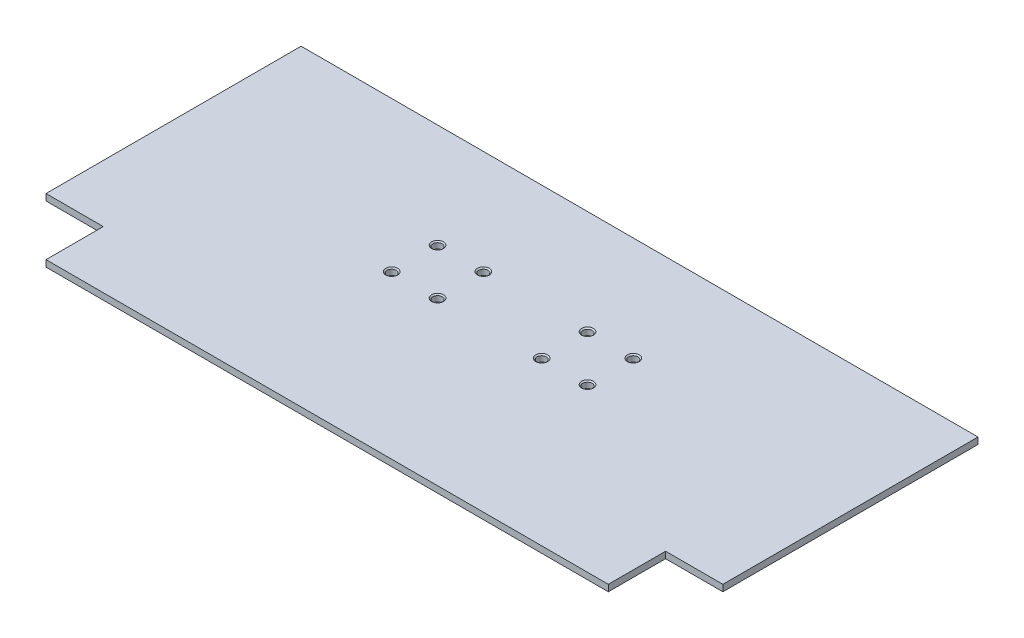
ISO-10303-21;
HEADER;
FILE_DESCRIPTION(('STEP AP214'),'2;1');
FILE_NAME('part.step','',(''),(''),'','','');
FILE_SCHEMA(('AUTOMOTIVE_DESIGN { 1 0 10303 214 1 1 1 1 }'));
ENDSEC;
DATA;
#1=APPLICATION_CONTEXT('core data for automotive mechanical design processes');
#2=APPLICATION_PROTOCOL_DEFINITION('international standard','automotive_design',2000,#1);
#3=PRODUCT_CONTEXT('',#1,'mechanical');
#4=PRODUCT('Part','Part','',(#3));
#5=PRODUCT_RELATED_PRODUCT_CATEGORY('part','',(#4));
#6=PRODUCT_DEFINITION_FORMATION('','',#4);
#7=PRODUCT_DEFINITION_CONTEXT('part definition',#1,'design');
#8=PRODUCT_DEFINITION('design','',#6,#7);
#9=PRODUCT_DEFINITION_SHAPE('','',#8);
#10=(LENGTH_UNIT() NAMED_UNIT(*) SI_UNIT(.MILLI.,.METRE.));
#11=(NAMED_UNIT(*) PLANE_ANGLE_UNIT() SI_UNIT($,.RADIAN.));
#12=(NAMED_UNIT(*) SI_UNIT($,.STERADIAN.) SOLID_ANGLE_UNIT());
#13=UNCERTAINTY_MEASURE_WITH_UNIT(LENGTH_MEASURE(1.E-05),#10,'distance_accuracy_value','');
#14=(GEOMETRIC_REPRESENTATION_CONTEXT(3) GLOBAL_UNCERTAINTY_ASSIGNED_CONTEXT((#13)) GLOBAL_UNIT_ASSIGNED_CONTEXT((#10,
#11,#12)) REPRESENTATION_CONTEXT('',''));
#15=CARTESIAN_POINT('',(0.,0.,0.));
#16=DIRECTION('',(0.,0.,1.));
#17=DIRECTION('',(1.,0.,0.));
#18=AXIS2_PLACEMENT_3D('',#15,#16,#17);
#19=CARTESIAN_POINT('',(0.,0.,0.));
#20=DIRECTION('',(0.,1.,0.));
#21=DIRECTION('',(0.,0.,1.));
#22=AXIS2_PLACEMENT_3D('',#19,#20,#21);
#23=PLANE('',#22);
#24=CARTESIAN_POINT('',(25.4,0.,-28.448));
#25=DIRECTION('',(0.,1.,0.));
#26=DIRECTION('',(0.,0.,1.));
#27=AXIS2_PLACEMENT_3D('',#24,#25,#26);
#28=CIRCLE('',#27,2.2479);
#29=CARTESIAN_POINT('',(25.4,0.,-26.2001));
#30=VERTEX_POINT('',#29);
#31=EDGE_CURVE('E311',#30,#30,#28,.F.);
#32=ORIENTED_EDGE('',*,*,#31,.F.);
#33=EDGE_LOOP('',(#32));
#34=FACE_BOUND('',#33,.T.);
#35=CARTESIAN_POINT('',(47.7520000000001,0.,-50.8));
#36=DIRECTION('',(0.,1.,0.));
#37=DIRECTION('',(0.,0.,1.));
#38=AXIS2_PLACEMENT_3D('',#35,#36,#37);
#39=CIRCLE('',#38,2.2479);
#40=CARTESIAN_POINT('',(47.7520000000001,0.,-48.5521));
#41=VERTEX_POINT('',#40);
#42=EDGE_CURVE('E329',#41,#41,#39,.F.);
#43=ORIENTED_EDGE('',*,*,#42,.F.);
#44=EDGE_LOOP('',(#43));
#45=FACE_BOUND('',#44,.T.);
#46=CARTESIAN_POINT('',(47.752,0.,-28.448));
#47=DIRECTION('',(0.,1.,0.));
#48=DIRECTION('',(0.,0.,1.));
#49=AXIS2_PLACEMENT_3D('',#46,#47,#48);
#50=CIRCLE('',#49,2.2479);
#51=CARTESIAN_POINT('',(47.752,0.,-26.2001));
#52=VERTEX_POINT('',#51);
#53=EDGE_CURVE('E140',#52,#52,#50,.F.);
#54=ORIENTED_EDGE('',*,*,#53,.F.);
#55=EDGE_LOOP('',(#54));
#56=FACE_BOUND('',#55,.T.);
#57=DIRECTION('',(1.,0.,0.));
#58=VECTOR('',#57,1.);
#59=CARTESIAN_POINT('',(0.,0.,50.8));
#60=LINE('',#59,#58);
#61=CARTESIAN_POINT('',(-137.16,0.,50.8));
#62=VERTEX_POINT('',#61);
#63=CARTESIAN_POINT('',(137.16,0.,50.8));
#64=VERTEX_POINT('',#63);
#65=EDGE_CURVE('E137',#62,#64,#60,.T.);
#66=ORIENTED_EDGE('',*,*,#65,.F.);
#67=DIRECTION('',(0.,0.,-1.));
#68=VECTOR('',#67,1.);
#69=CARTESIAN_POINT('',(-137.16,0.,0.));
#70=LINE('',#69,#68);
#71=CARTESIAN_POINT('',(-137.16,0.,22.86));
#72=VERTEX_POINT('',#71);
#73=EDGE_CURVE('E155',#62,#72,#70,.T.);
#74=ORIENTED_EDGE('',*,*,#73,.T.);
#75=DIRECTION('',(1.,0.,0.));
#76=VECTOR('',#75,1.);
#77=CARTESIAN_POINT('',(0.,0.,22.86));
#78=LINE('',#77,#76);
#79=CARTESIAN_POINT('',(-165.1,0.,22.86));
#80=VERTEX_POINT('',#79);
#81=EDGE_CURVE('E153',#80,#72,#78,.T.);
#82=ORIENTED_EDGE('',*,*,#81,.F.);
#83=DIRECTION('',(0.,0.,1.));
#84=VECTOR('',#83,1.);
#85=CARTESIAN_POINT('',(-165.1,0.,0.));
#86=LINE('',#85,#84);
#87=CARTESIAN_POINT('',(-165.1,0.,-101.6));
#88=VERTEX_POINT('',#87);
#89=EDGE_CURVE('E126',#88,#80,#86,.T.);
#90=ORIENTED_EDGE('',*,*,#89,.F.);
#91=DIRECTION('',(1.,0.,0.));
#92=VECTOR('',#91,1.);
#93=CARTESIAN_POINT('',(0.,0.,-101.6));
#94=LINE('',#93,#92);
#95=CARTESIAN_POINT('',(165.1,0.,-101.6));
#96=VERTEX_POINT('',#95);
#97=EDGE_CURVE('E149',#88,#96,#94,.T.);
#98=ORIENTED_EDGE('',*,*,#97,.T.);
#99=DIRECTION('',(0.,0.,1.));
#100=VECTOR('',#99,1.);
#101=CARTESIAN_POINT('',(165.1,0.,0.));
#102=LINE('',#101,#100);
#103=CARTESIAN_POINT('',(165.1,0.,22.86));
#104=VERTEX_POINT('',#103);
#105=EDGE_CURVE('E146',#96,#104,#102,.T.);
#106=ORIENTED_EDGE('',*,*,#105,.T.);
#107=DIRECTION('',(-1.,0.,0.));
#108=VECTOR('',#107,1.);
#109=CARTESIAN_POINT('',(0.,0.,22.86));
#110=LINE('',#109,#108);
#111=CARTESIAN_POINT('',(137.16,0.,22.86));
#112=VERTEX_POINT('',#111);
#113=EDGE_CURVE('E143',#104,#112,#110,.T.);
#114=ORIENTED_EDGE('',*,*,#113,.T.);
#115=DIRECTION('',(0.,0.,-1.));
#116=VECTOR('',#115,1.);
#117=CARTESIAN_POINT('',(137.16,0.,0.));
#118=LINE('',#117,#116);
#119=EDGE_CURVE('E139',#64,#112,#118,.T.);
#120=ORIENTED_EDGE('',*,*,#119,.F.);
#121=EDGE_LOOP('',(#66,#74,#82,#90,#98,#106,#114,#120));
#122=FACE_BOUND('',#121,.T.);
#123=CARTESIAN_POINT('',(25.4000000000001,0.,-50.8));
#124=DIRECTION('',(0.,1.,0.));
#125=DIRECTION('',(0.,0.,1.));
#126=AXIS2_PLACEMENT_3D('',#123,#124,#125);
#127=CIRCLE('',#126,2.2479);
#128=CARTESIAN_POINT('',(25.4000000000001,0.,-48.5521));
#129=VERTEX_POINT('',#128);
#130=EDGE_CURVE('E320',#129,#129,#127,.F.);
#131=ORIENTED_EDGE('',*,*,#130,.F.);
#132=EDGE_LOOP('',(#131));
#133=FACE_BOUND('',#132,.T.);
#134=CARTESIAN_POINT('',(-47.752,0.,-28.448));
#135=DIRECTION('',(0.,1.,0.));
#136=DIRECTION('',(0.,0.,1.));
#137=AXIS2_PLACEMENT_3D('',#134,#135,#136);
#138=CIRCLE('',#137,2.2479);
#139=CARTESIAN_POINT('',(-47.752,0.,-26.2001));
#140=VERTEX_POINT('',#139);
#141=EDGE_CURVE('E302',#140,#140,#138,.F.);
#142=ORIENTED_EDGE('',*,*,#141,.F.);
#143=EDGE_LOOP('',(#142));
#144=FACE_BOUND('',#143,.T.);
#145=CARTESIAN_POINT('',(-25.4,0.,-28.448));
#146=DIRECTION('',(0.,1.,0.));
#147=DIRECTION('',(0.,0.,1.));
#148=AXIS2_PLACEMENT_3D('',#145,#146,#147);
#149=CIRCLE('',#148,2.2479);
#150=CARTESIAN_POINT('',(-25.4,0.,-26.2001));
#151=VERTEX_POINT('',#150);
#152=EDGE_CURVE('E293',#151,#151,#149,.F.);
#153=ORIENTED_EDGE('',*,*,#152,.F.);
#154=EDGE_LOOP('',(#153));
#155=FACE_BOUND('',#154,.T.);
#156=CARTESIAN_POINT('',(-25.4000000000001,0.,-50.8));
#157=DIRECTION('',(0.,1.,0.));
#158=DIRECTION('',(0.,0.,1.));
#159=AXIS2_PLACEMENT_3D('',#156,#157,#158);
#160=CIRCLE('',#159,2.2479);
#161=CARTESIAN_POINT('',(-25.4000000000001,0.,-48.5521));
#162=VERTEX_POINT('',#161);
#163=EDGE_CURVE('E283',#162,#162,#160,.F.);
#164=ORIENTED_EDGE('',*,*,#163,.F.);
#165=EDGE_LOOP('',(#164));
#166=FACE_BOUND('',#165,.T.);
#167=CARTESIAN_POINT('',(-47.7520000000001,0.,-50.8));
#168=DIRECTION('',(0.,1.,0.));
#169=DIRECTION('',(0.,0.,1.));
#170=AXIS2_PLACEMENT_3D('',#167,#168,#169);
#171=CIRCLE('',#170,2.2479);
#172=CARTESIAN_POINT('',(-47.7520000000001,0.,-48.5521));
#173=VERTEX_POINT('',#172);
#174=EDGE_CURVE('E279',#173,#173,#171,.F.);
#175=ORIENTED_EDGE('',*,*,#174,.F.);
#176=EDGE_LOOP('',(#175));
#177=FACE_BOUND('',#176,.T.);
#178=ADVANCED_FACE('F39',(#34,#45,#56,#122,#133,#144,#155,#166,#177),#23,.F.);
#179=CARTESIAN_POINT('',(0.,3.175,50.8));
#180=DIRECTION('',(0.,0.,-1.));
#181=DIRECTION('',(-1.,0.,0.));
#182=AXIS2_PLACEMENT_3D('',#179,#180,#181);
#183=PLANE('',#182);
#184=ORIENTED_EDGE('',*,*,#65,.T.);
#185=DIRECTION('',(0.,-1.,0.));
#186=VECTOR('',#185,1.);
#187=CARTESIAN_POINT('',(137.16,3.175,50.8));
#188=LINE('',#187,#186);
#189=CARTESIAN_POINT('',(137.16,3.175,50.8));
#190=VERTEX_POINT('',#189);
#191=EDGE_CURVE('E11',#190,#64,#188,.T.);
#192=ORIENTED_EDGE('',*,*,#191,.F.);
#193=DIRECTION('',(1.,0.,0.));
#194=VECTOR('',#193,1.);
#195=CARTESIAN_POINT('',(0.,3.175,50.8));
#196=LINE('',#195,#194);
#197=CARTESIAN_POINT('',(-137.16,3.175,50.8));
#198=VERTEX_POINT('',#197);
#199=EDGE_CURVE('E158',#198,#190,#196,.T.);
#200=ORIENTED_EDGE('',*,*,#199,.F.);
#201=DIRECTION('',(0.,-1.,0.));
#202=VECTOR('',#201,1.);
#203=CARTESIAN_POINT('',(-137.16,3.175,50.8));
#204=LINE('',#203,#202);
#205=EDGE_CURVE('E56',#198,#62,#204,.T.);
#206=ORIENTED_EDGE('',*,*,#205,.T.);
#207=EDGE_LOOP('',(#184,#192,#200,#206));
#208=FACE_BOUND('',#207,.T.);
#209=ADVANCED_FACE('F41',(#208),#183,.F.);
#210=CARTESIAN_POINT('',(137.16,3.175,0.));
#211=DIRECTION('',(-1.,0.,0.));
#212=DIRECTION('',(0.,0.,1.));
#213=AXIS2_PLACEMENT_3D('',#210,#211,#212);
#214=PLANE('',#213);
#215=ORIENTED_EDGE('',*,*,#119,.T.);
#216=DIRECTION('',(0.,-1.,0.));
#217=VECTOR('',#216,1.);
#218=CARTESIAN_POINT('',(137.16,3.175,22.86));
#219=LINE('',#218,#217);
#220=CARTESIAN_POINT('',(137.16,3.175,22.86));
#221=VERTEX_POINT('',#220);
#222=EDGE_CURVE('E48',#221,#112,#219,.T.);
#223=ORIENTED_EDGE('',*,*,#222,.F.);
#224=DIRECTION('',(0.,0.,-1.));
#225=VECTOR('',#224,1.);
#226=CARTESIAN_POINT('',(137.16,3.175,0.));
#227=LINE('',#226,#225);
#228=EDGE_CURVE('E95',#190,#221,#227,.T.);
#229=ORIENTED_EDGE('',*,*,#228,.F.);
#230=ORIENTED_EDGE('',*,*,#191,.T.);
#231=EDGE_LOOP('',(#215,#223,#229,#230));
#232=FACE_BOUND('',#231,.T.);
#233=ADVANCED_FACE('F171',(#232),#214,.F.);
#234=CARTESIAN_POINT('',(0.,3.175,22.86));
#235=DIRECTION('',(0.,0.,1.));
#236=DIRECTION('',(1.,0.,0.));
#237=AXIS2_PLACEMENT_3D('',#234,#235,#236);
#238=PLANE('',#237);
#239=ORIENTED_EDGE('',*,*,#113,.F.);
#240=DIRECTION('',(0.,-1.,0.));
#241=VECTOR('',#240,1.);
#242=CARTESIAN_POINT('',(165.1,3.175,22.86));
#243=LINE('',#242,#241);
#244=CARTESIAN_POINT('',(165.1,3.175,22.86));
#245=VERTEX_POINT('',#244);
#246=EDGE_CURVE('E164',#245,#104,#243,.T.);
#247=ORIENTED_EDGE('',*,*,#246,.F.);
#248=DIRECTION('',(-1.,0.,0.));
#249=VECTOR('',#248,1.);
#250=CARTESIAN_POINT('',(0.,3.175,22.86));
#251=LINE('',#250,#249);
#252=EDGE_CURVE('E170',#245,#221,#251,.T.);
#253=ORIENTED_EDGE('',*,*,#252,.T.);
#254=ORIENTED_EDGE('',*,*,#222,.T.);
#255=EDGE_LOOP('',(#239,#247,#253,#254));
#256=FACE_BOUND('',#255,.T.);
#257=ADVANCED_FACE('F168',(#256),#238,.T.);
#258=CARTESIAN_POINT('',(165.1,3.175,0.));
#259=DIRECTION('',(1.,0.,0.));
#260=DIRECTION('',(0.,0.,-1.));
#261=AXIS2_PLACEMENT_3D('',#258,#259,#260);
#262=PLANE('',#261);
#263=ORIENTED_EDGE('',*,*,#105,.F.);
#264=DIRECTION('',(0.,-1.,0.));
#265=VECTOR('',#264,1.);
#266=CARTESIAN_POINT('',(165.1,3.175,-101.6));
#267=LINE('',#266,#265);
#268=CARTESIAN_POINT('',(165.1,3.175,-101.6));
#269=VERTEX_POINT('',#268);
#270=EDGE_CURVE('E162',#269,#96,#267,.T.);
#271=ORIENTED_EDGE('',*,*,#270,.F.);
#272=DIRECTION('',(0.,0.,1.));
#273=VECTOR('',#272,1.);
#274=CARTESIAN_POINT('',(165.1,3.175,0.));
#275=LINE('',#274,#273);
#276=EDGE_CURVE('E180',#269,#245,#275,.T.);
#277=ORIENTED_EDGE('',*,*,#276,.T.);
#278=ORIENTED_EDGE('',*,*,#246,.T.);
#279=EDGE_LOOP('',(#263,#271,#277,#278));
#280=FACE_BOUND('',#279,.T.);
#281=ADVANCED_FACE('F178',(#280),#262,.T.);
#282=CARTESIAN_POINT('',(0.,3.175,-101.6));
#283=DIRECTION('',(0.,0.,-1.));
#284=DIRECTION('',(-1.,0.,0.));
#285=AXIS2_PLACEMENT_3D('',#282,#283,#284);
#286=PLANE('',#285);
#287=ORIENTED_EDGE('',*,*,#97,.F.);
#288=DIRECTION('',(0.,-1.,0.));
#289=VECTOR('',#288,1.);
#290=CARTESIAN_POINT('',(-165.1,3.175,-101.6));
#291=LINE('',#290,#289);
#292=CARTESIAN_POINT('',(-165.1,3.175,-101.6));
#293=VERTEX_POINT('',#292);
#294=EDGE_CURVE('E129',#293,#88,#291,.T.);
#295=ORIENTED_EDGE('',*,*,#294,.F.);
#296=DIRECTION('',(1.,0.,0.));
#297=VECTOR('',#296,1.);
#298=CARTESIAN_POINT('',(0.,3.175,-101.6));
#299=LINE('',#298,#297);
#300=EDGE_CURVE('E119',#293,#269,#299,.T.);
#301=ORIENTED_EDGE('',*,*,#300,.T.);
#302=ORIENTED_EDGE('',*,*,#270,.T.);
#303=EDGE_LOOP('',(#287,#295,#301,#302));
#304=FACE_BOUND('',#303,.T.);
#305=ADVANCED_FACE('F186',(#304),#286,.T.);
#306=CARTESIAN_POINT('',(-165.1,3.175,0.));
#307=DIRECTION('',(1.,0.,0.));
#308=DIRECTION('',(0.,0.,-1.));
#309=AXIS2_PLACEMENT_3D('',#306,#307,#308);
#310=PLANE('',#309);
#311=ORIENTED_EDGE('',*,*,#89,.T.);
#312=DIRECTION('',(0.,-1.,0.));
#313=VECTOR('',#312,1.);
#314=CARTESIAN_POINT('',(-165.1,3.175,22.86));
#315=LINE('',#314,#313);
#316=CARTESIAN_POINT('',(-165.1,3.175,22.86));
#317=VERTEX_POINT('',#316);
#318=EDGE_CURVE('E123',#317,#80,#315,.T.);
#319=ORIENTED_EDGE('',*,*,#318,.F.);
#320=DIRECTION('',(0.,0.,1.));
#321=VECTOR('',#320,1.);
#322=CARTESIAN_POINT('',(-165.1,3.175,0.));
#323=LINE('',#322,#321);
#324=EDGE_CURVE('E111',#293,#317,#323,.T.);
#325=ORIENTED_EDGE('',*,*,#324,.F.);
#326=ORIENTED_EDGE('',*,*,#294,.T.);
#327=EDGE_LOOP('',(#311,#319,#325,#326));
#328=FACE_BOUND('',#327,.T.);
#329=ADVANCED_FACE('F124',(#328),#310,.F.);
#330=CARTESIAN_POINT('',(0.,3.175,22.86));
#331=DIRECTION('',(0.,0.,-1.));
#332=DIRECTION('',(-1.,0.,0.));
#333=AXIS2_PLACEMENT_3D('',#330,#331,#332);
#334=PLANE('',#333);
#335=ORIENTED_EDGE('',*,*,#81,.T.);
#336=DIRECTION('',(0.,-1.,0.));
#337=VECTOR('',#336,1.);
#338=CARTESIAN_POINT('',(-137.16,3.175,22.86));
#339=LINE('',#338,#337);
#340=CARTESIAN_POINT('',(-137.16,3.175,22.86));
#341=VERTEX_POINT('',#340);
#342=EDGE_CURVE('E83',#341,#72,#339,.T.);
#343=ORIENTED_EDGE('',*,*,#342,.F.);
#344=DIRECTION('',(1.,0.,0.));
#345=VECTOR('',#344,1.);
#346=CARTESIAN_POINT('',(0.,3.175,22.86));
#347=LINE('',#346,#345);
#348=EDGE_CURVE('E116',#317,#341,#347,.T.);
#349=ORIENTED_EDGE('',*,*,#348,.F.);
#350=ORIENTED_EDGE('',*,*,#318,.T.);
#351=EDGE_LOOP('',(#335,#343,#349,#350));
#352=FACE_BOUND('',#351,.T.);
#353=ADVANCED_FACE('F131',(#352),#334,.F.);
#354=CARTESIAN_POINT('',(-137.16,3.175,0.));
#355=DIRECTION('',(-1.,0.,0.));
#356=DIRECTION('',(0.,0.,1.));
#357=AXIS2_PLACEMENT_3D('',#354,#355,#356);
#358=PLANE('',#357);
#359=ORIENTED_EDGE('',*,*,#73,.F.);
#360=ORIENTED_EDGE('',*,*,#205,.F.);
#361=DIRECTION('',(0.,0.,-1.));
#362=VECTOR('',#361,1.);
#363=CARTESIAN_POINT('',(-137.16,3.175,0.));
#364=LINE('',#363,#362);
#365=EDGE_CURVE('E132',#198,#341,#364,.T.);
#366=ORIENTED_EDGE('',*,*,#365,.T.);
#367=ORIENTED_EDGE('',*,*,#342,.T.);
#368=EDGE_LOOP('',(#359,#360,#366,#367));
#369=FACE_BOUND('',#368,.T.);
#370=ADVANCED_FACE('F187',(#369),#358,.T.);
#371=CARTESIAN_POINT('',(0.,3.175,0.));
#372=DIRECTION('',(0.,1.,0.));
#373=DIRECTION('',(0.,0.,1.));
#374=AXIS2_PLACEMENT_3D('',#371,#372,#373);
#375=PLANE('',#374);
#376=CARTESIAN_POINT('',(-47.7520000000001,3.175,-50.8));
#377=DIRECTION('',(0.,1.,0.));
#378=DIRECTION('',(0.,0.,1.));
#379=AXIS2_PLACEMENT_3D('',#376,#377,#378);
#380=CIRCLE('',#379,2.8829);
#381=CARTESIAN_POINT('',(-47.7520000000001,3.175,-47.9171));
#382=VERTEX_POINT('',#381);
#383=EDGE_CURVE('E277',#382,#382,#380,.T.);
#384=ORIENTED_EDGE('',*,*,#383,.F.);
#385=EDGE_LOOP('',(#384));
#386=FACE_BOUND('',#385,.T.);
#387=CARTESIAN_POINT('',(-25.4000000000001,3.175,-50.8));
#388=DIRECTION('',(0.,1.,0.));
#389=DIRECTION('',(0.,0.,1.));
#390=AXIS2_PLACEMENT_3D('',#387,#388,#389);
#391=CIRCLE('',#390,2.8829);
#392=CARTESIAN_POINT('',(-25.4000000000001,3.175,-47.9171));
#393=VERTEX_POINT('',#392);
#394=EDGE_CURVE('E288',#393,#393,#391,.T.);
#395=ORIENTED_EDGE('',*,*,#394,.F.);
#396=EDGE_LOOP('',(#395));
#397=FACE_BOUND('',#396,.T.);
#398=CARTESIAN_POINT('',(-25.4,3.175,-28.448));
#399=DIRECTION('',(0.,1.,0.));
#400=DIRECTION('',(0.,0.,1.));
#401=AXIS2_PLACEMENT_3D('',#398,#399,#400);
#402=CIRCLE('',#401,2.8829);
#403=CARTESIAN_POINT('',(-25.4,3.175,-25.5651));
#404=VERTEX_POINT('',#403);
#405=EDGE_CURVE('E286',#404,#404,#402,.T.);
#406=ORIENTED_EDGE('',*,*,#405,.F.);
#407=EDGE_LOOP('',(#406));
#408=FACE_BOUND('',#407,.T.);
#409=CARTESIAN_POINT('',(-47.752,3.175,-28.448));
#410=DIRECTION('',(0.,1.,0.));
#411=DIRECTION('',(0.,0.,1.));
#412=AXIS2_PLACEMENT_3D('',#409,#410,#411);
#413=CIRCLE('',#412,2.8829);
#414=CARTESIAN_POINT('',(-47.752,3.175,-25.5651));
#415=VERTEX_POINT('',#414);
#416=EDGE_CURVE('E296',#415,#415,#413,.T.);
#417=ORIENTED_EDGE('',*,*,#416,.F.);
#418=EDGE_LOOP('',(#417));
#419=FACE_BOUND('',#418,.T.);
#420=CARTESIAN_POINT('',(25.4,3.175,-28.448));
#421=DIRECTION('',(0.,1.,0.));
#422=DIRECTION('',(0.,0.,1.));
#423=AXIS2_PLACEMENT_3D('',#420,#421,#422);
#424=CIRCLE('',#423,2.8829);
#425=CARTESIAN_POINT('',(25.4,3.175,-25.5651));
#426=VERTEX_POINT('',#425);
#427=EDGE_CURVE('E305',#426,#426,#424,.T.);
#428=ORIENTED_EDGE('',*,*,#427,.F.);
#429=EDGE_LOOP('',(#428));
#430=FACE_BOUND('',#429,.T.);
#431=CARTESIAN_POINT('',(25.4000000000001,3.175,-50.8));
#432=DIRECTION('',(0.,1.,0.));
#433=DIRECTION('',(0.,0.,1.));
#434=AXIS2_PLACEMENT_3D('',#431,#432,#433);
#435=CIRCLE('',#434,2.8829);
#436=CARTESIAN_POINT('',(25.4000000000001,3.175,-47.9171));
#437=VERTEX_POINT('',#436);
#438=EDGE_CURVE('E314',#437,#437,#435,.T.);
#439=ORIENTED_EDGE('',*,*,#438,.F.);
#440=EDGE_LOOP('',(#439));
#441=FACE_BOUND('',#440,.T.);
#442=CARTESIAN_POINT('',(47.7520000000001,3.175,-50.8));
#443=DIRECTION('',(0.,1.,0.));
#444=DIRECTION('',(0.,0.,1.));
#445=AXIS2_PLACEMENT_3D('',#442,#443,#444);
#446=CIRCLE('',#445,2.8829);
#447=CARTESIAN_POINT('',(47.7520000000001,3.175,-47.9171));
#448=VERTEX_POINT('',#447);
#449=EDGE_CURVE('E323',#448,#448,#446,.T.);
#450=ORIENTED_EDGE('',*,*,#449,.F.);
#451=EDGE_LOOP('',(#450));
#452=FACE_BOUND('',#451,.T.);
#453=CARTESIAN_POINT('',(47.752,3.175,-28.448));
#454=DIRECTION('',(0.,1.,0.));
#455=DIRECTION('',(0.,0.,1.));
#456=AXIS2_PLACEMENT_3D('',#453,#454,#455);
#457=CIRCLE('',#456,2.8829);
#458=CARTESIAN_POINT('',(47.752,3.175,-25.5651));
#459=VERTEX_POINT('',#458);
#460=EDGE_CURVE('E332',#459,#459,#457,.T.);
#461=ORIENTED_EDGE('',*,*,#460,.F.);
#462=EDGE_LOOP('',(#461));
#463=FACE_BOUND('',#462,.T.);
#464=ORIENTED_EDGE('',*,*,#199,.T.);
#465=ORIENTED_EDGE('',*,*,#228,.T.);
#466=ORIENTED_EDGE('',*,*,#252,.F.);
#467=ORIENTED_EDGE('',*,*,#276,.F.);
#468=ORIENTED_EDGE('',*,*,#300,.F.);
#469=ORIENTED_EDGE('',*,*,#324,.T.);
#470=ORIENTED_EDGE('',*,*,#348,.T.);
#471=ORIENTED_EDGE('',*,*,#365,.F.);
#472=EDGE_LOOP('',(#464,#465,#466,#467,#468,#469,#470,#471));
#473=FACE_BOUND('',#472,.T.);
#474=ADVANCED_FACE('F113',(#386,#397,#408,#419,#430,#441,#452,#463,#473),#375,.T.);
#475=CARTESIAN_POINT('',(47.752,3.175,-28.448));
#476=DIRECTION('',(0.,1.,0.));
#477=DIRECTION('',(0.,0.,1.));
#478=AXIS2_PLACEMENT_3D('',#475,#476,#477);
#479=CYLINDRICAL_SURFACE('',#478,2.2479);
#480=ORIENTED_EDGE('',*,*,#53,.T.);
#481=EDGE_LOOP('',(#480));
#482=FACE_BOUND('',#481,.T.);
#483=CARTESIAN_POINT('',(47.752,2.64217173420243,-28.448));
#484=DIRECTION('',(0.,1.,0.));
#485=DIRECTION('',(0.,0.,1.));
#486=AXIS2_PLACEMENT_3D('',#483,#484,#485);
#487=CIRCLE('',#486,2.2479);
#488=CARTESIAN_POINT('',(47.752,2.64217173420243,-26.2001));
#489=VERTEX_POINT('',#488);
#490=EDGE_CURVE('E340',#489,#489,#487,.T.);
#491=ORIENTED_EDGE('',*,*,#490,.T.);
#492=EDGE_LOOP('',(#491));
#493=FACE_BOUND('',#492,.T.);
#494=ADVANCED_FACE('F194',(#482,#493),#479,.F.);
#495=CARTESIAN_POINT('',(47.752,3.175,-28.448));
#496=DIRECTION('',(0.,1.,0.));
#497=DIRECTION('',(0.,0.,1.));
#498=AXIS2_PLACEMENT_3D('',#495,#496,#497);
#499=CONICAL_SURFACE('',#498,2.8829,0.872664625997165);
#500=ORIENTED_EDGE('',*,*,#490,.F.);
#501=EDGE_LOOP('',(#500));
#502=FACE_BOUND('',#501,.T.);
#503=ORIENTED_EDGE('',*,*,#460,.T.);
#504=EDGE_LOOP('',(#503));
#505=FACE_BOUND('',#504,.T.);
#506=ADVANCED_FACE('F209',(#502,#505),#499,.F.);
#507=CARTESIAN_POINT('',(47.7520000000001,3.175,-50.8));
#508=DIRECTION('',(0.,1.,0.));
#509=DIRECTION('',(0.,0.,1.));
#510=AXIS2_PLACEMENT_3D('',#507,#508,#509);
#511=CYLINDRICAL_SURFACE('',#510,2.2479);
#512=ORIENTED_EDGE('',*,*,#42,.T.);
#513=EDGE_LOOP('',(#512));
#514=FACE_BOUND('',#513,.T.);
#515=CARTESIAN_POINT('',(47.7520000000001,2.64217173420243,-50.8));
#516=DIRECTION('',(0.,1.,0.));
#517=DIRECTION('',(0.,0.,1.));
#518=AXIS2_PLACEMENT_3D('',#515,#516,#517);
#519=CIRCLE('',#518,2.2479);
#520=CARTESIAN_POINT('',(47.7520000000001,2.64217173420243,-48.5521));
#521=VERTEX_POINT('',#520);
#522=EDGE_CURVE('E333',#521,#521,#519,.T.);
#523=ORIENTED_EDGE('',*,*,#522,.T.);
#524=EDGE_LOOP('',(#523));
#525=FACE_BOUND('',#524,.T.);
#526=ADVANCED_FACE('F213',(#514,#525),#511,.F.);
#527=CARTESIAN_POINT('',(47.7520000000001,3.175,-50.8));
#528=DIRECTION('',(0.,1.,0.));
#529=DIRECTION('',(0.,0.,1.));
#530=AXIS2_PLACEMENT_3D('',#527,#528,#529);
#531=CONICAL_SURFACE('',#530,2.8829,0.872664625997165);
#532=ORIENTED_EDGE('',*,*,#522,.F.);
#533=EDGE_LOOP('',(#532));
#534=FACE_BOUND('',#533,.T.);
#535=ORIENTED_EDGE('',*,*,#449,.T.);
#536=EDGE_LOOP('',(#535));
#537=FACE_BOUND('',#536,.T.);
#538=ADVANCED_FACE('F217',(#534,#537),#531,.F.);
#539=CARTESIAN_POINT('',(25.4000000000001,3.175,-50.8));
#540=DIRECTION('',(0.,1.,0.));
#541=DIRECTION('',(0.,0.,1.));
#542=AXIS2_PLACEMENT_3D('',#539,#540,#541);
#543=CYLINDRICAL_SURFACE('',#542,2.2479);
#544=ORIENTED_EDGE('',*,*,#130,.T.);
#545=EDGE_LOOP('',(#544));
#546=FACE_BOUND('',#545,.T.);
#547=CARTESIAN_POINT('',(25.4000000000001,2.64217173420243,-50.8));
#548=DIRECTION('',(0.,1.,0.));
#549=DIRECTION('',(0.,0.,1.));
#550=AXIS2_PLACEMENT_3D('',#547,#548,#549);
#551=CIRCLE('',#550,2.2479);
#552=CARTESIAN_POINT('',(25.4000000000001,2.64217173420243,-48.5521));
#553=VERTEX_POINT('',#552);
#554=EDGE_CURVE('E324',#553,#553,#551,.T.);
#555=ORIENTED_EDGE('',*,*,#554,.T.);
#556=EDGE_LOOP('',(#555));
#557=FACE_BOUND('',#556,.T.);
#558=ADVANCED_FACE('F221',(#546,#557),#543,.F.);
#559=CARTESIAN_POINT('',(25.4000000000001,3.175,-50.8));
#560=DIRECTION('',(0.,1.,0.));
#561=DIRECTION('',(0.,0.,1.));
#562=AXIS2_PLACEMENT_3D('',#559,#560,#561);
#563=CONICAL_SURFACE('',#562,2.8829,0.872664625997162);
#564=ORIENTED_EDGE('',*,*,#554,.F.);
#565=EDGE_LOOP('',(#564));
#566=FACE_BOUND('',#565,.T.);
#567=ORIENTED_EDGE('',*,*,#438,.T.);
#568=EDGE_LOOP('',(#567));
#569=FACE_BOUND('',#568,.T.);
#570=ADVANCED_FACE('F225',(#566,#569),#563,.F.);
#571=CARTESIAN_POINT('',(25.4,3.175,-28.448));
#572=DIRECTION('',(0.,1.,0.));
#573=DIRECTION('',(0.,0.,1.));
#574=AXIS2_PLACEMENT_3D('',#571,#572,#573);
#575=CYLINDRICAL_SURFACE('',#574,2.2479);
#576=ORIENTED_EDGE('',*,*,#31,.T.);
#577=EDGE_LOOP('',(#576));
#578=FACE_BOUND('',#577,.T.);
#579=CARTESIAN_POINT('',(25.4,2.64217173420243,-28.448));
#580=DIRECTION('',(0.,1.,0.));
#581=DIRECTION('',(0.,0.,1.));
#582=AXIS2_PLACEMENT_3D('',#579,#580,#581);
#583=CIRCLE('',#582,2.2479);
#584=CARTESIAN_POINT('',(25.4,2.64217173420243,-26.2001));
#585=VERTEX_POINT('',#584);
#586=EDGE_CURVE('E315',#585,#585,#583,.T.);
#587=ORIENTED_EDGE('',*,*,#586,.T.);
#588=EDGE_LOOP('',(#587));
#589=FACE_BOUND('',#588,.T.);
#590=ADVANCED_FACE('F229',(#578,#589),#575,.F.);
#591=CARTESIAN_POINT('',(25.4,3.175,-28.448));
#592=DIRECTION('',(0.,1.,0.));
#593=DIRECTION('',(0.,0.,1.));
#594=AXIS2_PLACEMENT_3D('',#591,#592,#593);
#595=CONICAL_SURFACE('',#594,2.8829,0.872664625997162);
#596=ORIENTED_EDGE('',*,*,#586,.F.);
#597=EDGE_LOOP('',(#596));
#598=FACE_BOUND('',#597,.T.);
#599=ORIENTED_EDGE('',*,*,#427,.T.);
#600=EDGE_LOOP('',(#599));
#601=FACE_BOUND('',#600,.T.);
#602=ADVANCED_FACE('F233',(#598,#601),#595,.F.);
#603=CARTESIAN_POINT('',(-47.752,3.175,-28.448));
#604=DIRECTION('',(0.,1.,0.));
#605=DIRECTION('',(0.,0.,1.));
#606=AXIS2_PLACEMENT_3D('',#603,#604,#605);
#607=CYLINDRICAL_SURFACE('',#606,2.2479);
#608=ORIENTED_EDGE('',*,*,#141,.T.);
#609=EDGE_LOOP('',(#608));
#610=FACE_BOUND('',#609,.T.);
#611=CARTESIAN_POINT('',(-47.752,2.64217173420243,-28.448));
#612=DIRECTION('',(0.,1.,0.));
#613=DIRECTION('',(0.,0.,1.));
#614=AXIS2_PLACEMENT_3D('',#611,#612,#613);
#615=CIRCLE('',#614,2.2479);
#616=CARTESIAN_POINT('',(-47.752,2.64217173420243,-26.2001));
#617=VERTEX_POINT('',#616);
#618=EDGE_CURVE('E306',#617,#617,#615,.T.);
#619=ORIENTED_EDGE('',*,*,#618,.T.);
#620=EDGE_LOOP('',(#619));
#621=FACE_BOUND('',#620,.T.);
#622=ADVANCED_FACE('F237',(#610,#621),#607,.F.);
#623=CARTESIAN_POINT('',(-47.752,3.175,-28.448));
#624=DIRECTION('',(0.,1.,0.));
#625=DIRECTION('',(0.,0.,1.));
#626=AXIS2_PLACEMENT_3D('',#623,#624,#625);
#627=CONICAL_SURFACE('',#626,2.8829,0.872664625997165);
#628=ORIENTED_EDGE('',*,*,#618,.F.);
#629=EDGE_LOOP('',(#628));
#630=FACE_BOUND('',#629,.T.);
#631=ORIENTED_EDGE('',*,*,#416,.T.);
#632=EDGE_LOOP('',(#631));
#633=FACE_BOUND('',#632,.T.);
#634=ADVANCED_FACE('F241',(#630,#633),#627,.F.);
#635=CARTESIAN_POINT('',(-25.4,3.175,-28.448));
#636=DIRECTION('',(0.,1.,0.));
#637=DIRECTION('',(0.,0.,1.));
#638=AXIS2_PLACEMENT_3D('',#635,#636,#637);
#639=CYLINDRICAL_SURFACE('',#638,2.2479);
#640=ORIENTED_EDGE('',*,*,#152,.T.);
#641=EDGE_LOOP('',(#640));
#642=FACE_BOUND('',#641,.T.);
#643=CARTESIAN_POINT('',(-25.4,2.64217173420243,-28.448));
#644=DIRECTION('',(0.,1.,0.));
#645=DIRECTION('',(0.,0.,1.));
#646=AXIS2_PLACEMENT_3D('',#643,#644,#645);
#647=CIRCLE('',#646,2.2479);
#648=CARTESIAN_POINT('',(-25.4,2.64217173420243,-26.2001));
#649=VERTEX_POINT('',#648);
#650=EDGE_CURVE('E297',#649,#649,#647,.T.);
#651=ORIENTED_EDGE('',*,*,#650,.T.);
#652=EDGE_LOOP('',(#651));
#653=FACE_BOUND('',#652,.T.);
#654=ADVANCED_FACE('F245',(#642,#653),#639,.F.);
#655=CARTESIAN_POINT('',(-25.4,3.175,-28.448));
#656=DIRECTION('',(0.,1.,0.));
#657=DIRECTION('',(0.,0.,1.));
#658=AXIS2_PLACEMENT_3D('',#655,#656,#657);
#659=CONICAL_SURFACE('',#658,2.8829,0.872664625997162);
#660=ORIENTED_EDGE('',*,*,#650,.F.);
#661=EDGE_LOOP('',(#660));
#662=FACE_BOUND('',#661,.T.);
#663=ORIENTED_EDGE('',*,*,#405,.T.);
#664=EDGE_LOOP('',(#663));
#665=FACE_BOUND('',#664,.T.);
#666=ADVANCED_FACE('F249',(#662,#665),#659,.F.);
#667=CARTESIAN_POINT('',(-25.4000000000001,3.175,-50.8));
#668=DIRECTION('',(0.,1.,0.));
#669=DIRECTION('',(0.,0.,1.));
#670=AXIS2_PLACEMENT_3D('',#667,#668,#669);
#671=CYLINDRICAL_SURFACE('',#670,2.2479);
#672=ORIENTED_EDGE('',*,*,#163,.T.);
#673=EDGE_LOOP('',(#672));
#674=FACE_BOUND('',#673,.T.);
#675=CARTESIAN_POINT('',(-25.4000000000001,2.64217173420243,-50.8));
#676=DIRECTION('',(0.,1.,0.));
#677=DIRECTION('',(0.,0.,1.));
#678=AXIS2_PLACEMENT_3D('',#675,#676,#677);
#679=CIRCLE('',#678,2.2479);
#680=CARTESIAN_POINT('',(-25.4000000000001,2.64217173420243,-48.5521));
#681=VERTEX_POINT('',#680);
#682=EDGE_CURVE('E287',#681,#681,#679,.T.);
#683=ORIENTED_EDGE('',*,*,#682,.T.);
#684=EDGE_LOOP('',(#683));
#685=FACE_BOUND('',#684,.T.);
#686=ADVANCED_FACE('F253',(#674,#685),#671,.F.);
#687=CARTESIAN_POINT('',(-25.4000000000001,3.175,-50.8));
#688=DIRECTION('',(0.,1.,0.));
#689=DIRECTION('',(0.,0.,1.));
#690=AXIS2_PLACEMENT_3D('',#687,#688,#689);
#691=CONICAL_SURFACE('',#690,2.8829,0.872664625997162);
#692=ORIENTED_EDGE('',*,*,#682,.F.);
#693=EDGE_LOOP('',(#692));
#694=FACE_BOUND('',#693,.T.);
#695=ORIENTED_EDGE('',*,*,#394,.T.);
#696=EDGE_LOOP('',(#695));
#697=FACE_BOUND('',#696,.T.);
#698=ADVANCED_FACE('F257',(#694,#697),#691,.F.);
#699=CARTESIAN_POINT('',(-47.7520000000001,3.175,-50.8));
#700=DIRECTION('',(0.,1.,0.));
#701=DIRECTION('',(0.,0.,1.));
#702=AXIS2_PLACEMENT_3D('',#699,#700,#701);
#703=CYLINDRICAL_SURFACE('',#702,2.2479);
#704=ORIENTED_EDGE('',*,*,#174,.T.);
#705=EDGE_LOOP('',(#704));
#706=FACE_BOUND('',#705,.T.);
#707=CARTESIAN_POINT('',(-47.7520000000001,2.64217173420243,-50.8));
#708=DIRECTION('',(0.,1.,0.));
#709=DIRECTION('',(0.,0.,1.));
#710=AXIS2_PLACEMENT_3D('',#707,#708,#709);
#711=CIRCLE('',#710,2.2479);
#712=CARTESIAN_POINT('',(-47.7520000000001,2.64217173420243,-48.5521));
#713=VERTEX_POINT('',#712);
#714=EDGE_CURVE('E274',#713,#713,#711,.T.);
#715=ORIENTED_EDGE('',*,*,#714,.T.);
#716=EDGE_LOOP('',(#715));
#717=FACE_BOUND('',#716,.T.);
#718=ADVANCED_FACE('F261',(#706,#717),#703,.F.);
#719=CARTESIAN_POINT('',(-47.7520000000001,3.175,-50.8));
#720=DIRECTION('',(0.,1.,0.));
#721=DIRECTION('',(0.,0.,1.));
#722=AXIS2_PLACEMENT_3D('',#719,#720,#721);
#723=CONICAL_SURFACE('',#722,2.8829,0.872664625997165);
#724=ORIENTED_EDGE('',*,*,#714,.F.);
#725=EDGE_LOOP('',(#724));
#726=FACE_BOUND('',#725,.T.);
#727=ORIENTED_EDGE('',*,*,#383,.T.);
#728=EDGE_LOOP('',(#727));
#729=FACE_BOUND('',#728,.T.);
#730=ADVANCED_FACE('F265',(#726,#729),#723,.F.);
#731=CLOSED_SHELL('',(#178,#209,#233,#257,#281,#305,#329,#353,#370,#474,#494,#506,#526,#538,
#558,#570,#590,#602,#622,#634,#654,#666,#686,#698,#718,#730));
#732=MANIFOLD_SOLID_BREP('B2',#731);
#733=ADVANCED_BREP_SHAPE_REPRESENTATION('',(#18,#732),#14);
#734=SHAPE_DEFINITION_REPRESENTATION(#9,#733);
ENDSEC;
END-ISO-10303-21;
